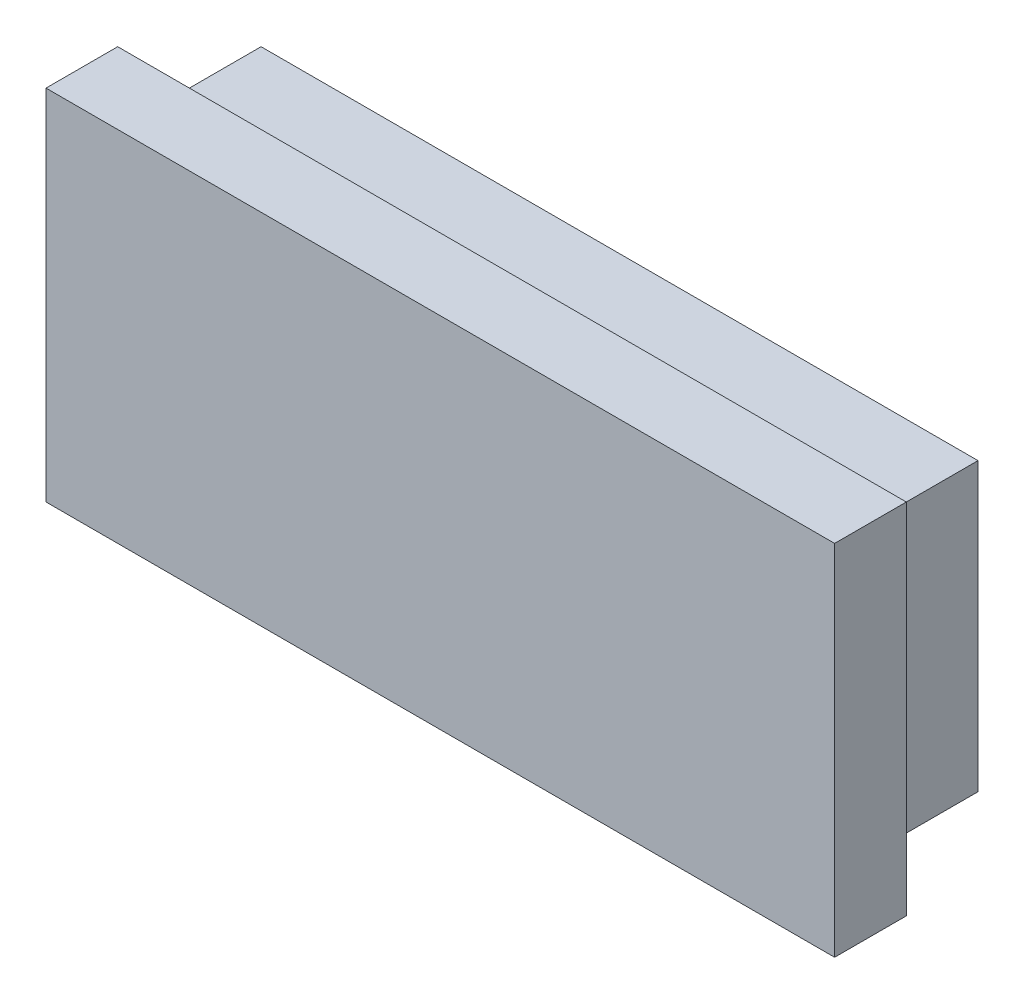
ISO-10303-21;
HEADER;
FILE_DESCRIPTION(('STEP AP214'),'2;1');
FILE_NAME('part.step','',(''),(''),'','','');
FILE_SCHEMA(('AUTOMOTIVE_DESIGN { 1 0 10303 214 1 1 1 1 }'));
ENDSEC;
DATA;
#1=APPLICATION_CONTEXT('core data for automotive mechanical design processes');
#2=APPLICATION_PROTOCOL_DEFINITION('international standard','automotive_design',2000,#1);
#3=PRODUCT_CONTEXT('',#1,'mechanical');
#4=PRODUCT('Part','Part','',(#3));
#5=PRODUCT_RELATED_PRODUCT_CATEGORY('part','',(#4));
#6=PRODUCT_DEFINITION_FORMATION('','',#4);
#7=PRODUCT_DEFINITION_CONTEXT('part definition',#1,'design');
#8=PRODUCT_DEFINITION('design','',#6,#7);
#9=PRODUCT_DEFINITION_SHAPE('','',#8);
#10=(LENGTH_UNIT() NAMED_UNIT(*) SI_UNIT(.MILLI.,.METRE.));
#11=(NAMED_UNIT(*) PLANE_ANGLE_UNIT() SI_UNIT($,.RADIAN.));
#12=(NAMED_UNIT(*) SI_UNIT($,.STERADIAN.) SOLID_ANGLE_UNIT());
#13=UNCERTAINTY_MEASURE_WITH_UNIT(LENGTH_MEASURE(1.E-05),#10,'distance_accuracy_value','');
#14=(GEOMETRIC_REPRESENTATION_CONTEXT(3) GLOBAL_UNCERTAINTY_ASSIGNED_CONTEXT((#13)) GLOBAL_UNIT_ASSIGNED_CONTEXT((#10,
#11,#12)) REPRESENTATION_CONTEXT('',''));
#15=CARTESIAN_POINT('',(0.,0.,0.));
#16=DIRECTION('',(0.,0.,1.));
#17=DIRECTION('',(1.,0.,0.));
#18=AXIS2_PLACEMENT_3D('',#15,#16,#17);
#19=CARTESIAN_POINT('',(0.,0.,0.635));
#20=DIRECTION('',(0.,0.,1.));
#21=DIRECTION('',(1.,0.,0.));
#22=AXIS2_PLACEMENT_3D('',#19,#20,#21);
#23=PLANE('',#22);
#24=DIRECTION('',(0.,1.,0.));
#25=VECTOR('',#24,1.);
#26=CARTESIAN_POINT('',(6.985,3.175,0.635));
#27=LINE('',#26,#25);
#28=CARTESIAN_POINT('',(6.985,-3.175,0.635));
#29=VERTEX_POINT('',#28);
#30=CARTESIAN_POINT('',(6.985,3.175,0.635));
#31=VERTEX_POINT('',#30);
#32=EDGE_CURVE('E132',#29,#31,#27,.T.);
#33=ORIENTED_EDGE('',*,*,#32,.F.);
#34=DIRECTION('',(1.,0.,0.));
#35=VECTOR('',#34,1.);
#36=CARTESIAN_POINT('',(-6.985,-3.175,0.635));
#37=LINE('',#36,#35);
#38=CARTESIAN_POINT('',(-6.985,-3.175,0.635));
#39=VERTEX_POINT('',#38);
#40=EDGE_CURVE('E128',#39,#29,#37,.T.);
#41=ORIENTED_EDGE('',*,*,#40,.F.);
#42=DIRECTION('',(0.,-1.,0.));
#43=VECTOR('',#42,1.);
#44=CARTESIAN_POINT('',(-6.985,3.175,0.635));
#45=LINE('',#44,#43);
#46=CARTESIAN_POINT('',(-6.985,3.175,0.635));
#47=VERTEX_POINT('',#46);
#48=EDGE_CURVE('E279',#47,#39,#45,.T.);
#49=ORIENTED_EDGE('',*,*,#48,.F.);
#50=DIRECTION('',(-1.,0.,0.));
#51=VECTOR('',#50,1.);
#52=CARTESIAN_POINT('',(-6.985,3.175,0.635));
#53=LINE('',#52,#51);
#54=EDGE_CURVE('E283',#31,#47,#53,.T.);
#55=ORIENTED_EDGE('',*,*,#54,.F.);
#56=EDGE_LOOP('',(#33,#41,#49,#55));
#57=FACE_BOUND('',#56,.T.);
#58=DIRECTION('',(1.,0.,0.));
#59=VECTOR('',#58,1.);
#60=CARTESIAN_POINT('',(-6.35,2.54,0.635));
#61=LINE('',#60,#59);
#62=CARTESIAN_POINT('',(-6.35,2.54,0.635));
#63=VERTEX_POINT('',#62);
#64=CARTESIAN_POINT('',(6.35,2.54,0.635));
#65=VERTEX_POINT('',#64);
#66=EDGE_CURVE('E11',#63,#65,#61,.T.);
#67=ORIENTED_EDGE('',*,*,#66,.F.);
#68=DIRECTION('',(0.,-1.,0.));
#69=VECTOR('',#68,1.);
#70=CARTESIAN_POINT('',(-6.35,2.54,0.635));
#71=LINE('',#70,#69);
#72=CARTESIAN_POINT('',(-6.35,-2.54,0.635));
#73=VERTEX_POINT('',#72);
#74=EDGE_CURVE('E145',#63,#73,#71,.T.);
#75=ORIENTED_EDGE('',*,*,#74,.T.);
#76=DIRECTION('',(1.,0.,0.));
#77=VECTOR('',#76,1.);
#78=CARTESIAN_POINT('',(-6.35,-2.54,0.635));
#79=LINE('',#78,#77);
#80=CARTESIAN_POINT('',(6.35,-2.54,0.635));
#81=VERTEX_POINT('',#80);
#82=EDGE_CURVE('E137',#73,#81,#79,.T.);
#83=ORIENTED_EDGE('',*,*,#82,.T.);
#84=DIRECTION('',(0.,-1.,0.));
#85=VECTOR('',#84,1.);
#86=CARTESIAN_POINT('',(6.35,2.54,0.635));
#87=LINE('',#86,#85);
#88=EDGE_CURVE('E55',#65,#81,#87,.T.);
#89=ORIENTED_EDGE('',*,*,#88,.F.);
#90=EDGE_LOOP('',(#67,#75,#83,#89));
#91=FACE_BOUND('',#90,.T.);
#92=ADVANCED_FACE('F39',(#57,#91),#23,.F.);
#93=CARTESIAN_POINT('',(6.985,3.175,1.905));
#94=DIRECTION('',(-1.,0.,0.));
#95=DIRECTION('',(0.,-1.,0.));
#96=AXIS2_PLACEMENT_3D('',#93,#94,#95);
#97=PLANE('',#96);
#98=ORIENTED_EDGE('',*,*,#32,.T.);
#99=DIRECTION('',(0.,0.,-1.));
#100=VECTOR('',#99,1.);
#101=CARTESIAN_POINT('',(6.985,3.175,1.905));
#102=LINE('',#101,#100);
#103=CARTESIAN_POINT('',(6.985,3.175,1.905));
#104=VERTEX_POINT('',#103);
#105=EDGE_CURVE('E110',#104,#31,#102,.T.);
#106=ORIENTED_EDGE('',*,*,#105,.F.);
#107=DIRECTION('',(0.,1.,0.));
#108=VECTOR('',#107,1.);
#109=CARTESIAN_POINT('',(6.985,3.175,1.905));
#110=LINE('',#109,#108);
#111=CARTESIAN_POINT('',(6.985,-3.175,1.905));
#112=VERTEX_POINT('',#111);
#113=EDGE_CURVE('E118',#112,#104,#110,.T.);
#114=ORIENTED_EDGE('',*,*,#113,.F.);
#115=DIRECTION('',(0.,0.,-1.));
#116=VECTOR('',#115,1.);
#117=CARTESIAN_POINT('',(6.985,-3.175,1.905));
#118=LINE('',#117,#116);
#119=EDGE_CURVE('E286',#112,#29,#118,.T.);
#120=ORIENTED_EDGE('',*,*,#119,.T.);
#121=EDGE_LOOP('',(#98,#106,#114,#120));
#122=FACE_BOUND('',#121,.T.);
#123=ADVANCED_FACE('F130',(#122),#97,.F.);
#124=CARTESIAN_POINT('',(-6.985,3.175,1.905));
#125=DIRECTION('',(0.,-1.,0.));
#126=DIRECTION('',(0.,0.,-1.));
#127=AXIS2_PLACEMENT_3D('',#124,#125,#126);
#128=PLANE('',#127);
#129=ORIENTED_EDGE('',*,*,#54,.T.);
#130=DIRECTION('',(0.,0.,-1.));
#131=VECTOR('',#130,1.);
#132=CARTESIAN_POINT('',(-6.985,3.175,1.905));
#133=LINE('',#132,#131);
#134=CARTESIAN_POINT('',(-6.985,3.175,1.905));
#135=VERTEX_POINT('',#134);
#136=EDGE_CURVE('E113',#135,#47,#133,.T.);
#137=ORIENTED_EDGE('',*,*,#136,.F.);
#138=DIRECTION('',(-1.,0.,0.));
#139=VECTOR('',#138,1.);
#140=CARTESIAN_POINT('',(-6.985,3.175,1.905));
#141=LINE('',#140,#139);
#142=EDGE_CURVE('E106',#104,#135,#141,.T.);
#143=ORIENTED_EDGE('',*,*,#142,.F.);
#144=ORIENTED_EDGE('',*,*,#105,.T.);
#145=EDGE_LOOP('',(#129,#137,#143,#144));
#146=FACE_BOUND('',#145,.T.);
#147=ADVANCED_FACE('F108',(#146),#128,.F.);
#148=CARTESIAN_POINT('',(-6.985,3.175,1.905));
#149=DIRECTION('',(1.,0.,0.));
#150=DIRECTION('',(0.,1.,0.));
#151=AXIS2_PLACEMENT_3D('',#148,#149,#150);
#152=PLANE('',#151);
#153=ORIENTED_EDGE('',*,*,#48,.T.);
#154=DIRECTION('',(0.,0.,-1.));
#155=VECTOR('',#154,1.);
#156=CARTESIAN_POINT('',(-6.985,-3.175,1.905));
#157=LINE('',#156,#155);
#158=CARTESIAN_POINT('',(-6.985,-3.175,1.905));
#159=VERTEX_POINT('',#158);
#160=EDGE_CURVE('E139',#159,#39,#157,.T.);
#161=ORIENTED_EDGE('',*,*,#160,.F.);
#162=DIRECTION('',(0.,-1.,0.));
#163=VECTOR('',#162,1.);
#164=CARTESIAN_POINT('',(-6.985,3.175,1.905));
#165=LINE('',#164,#163);
#166=EDGE_CURVE('E117',#135,#159,#165,.T.);
#167=ORIENTED_EDGE('',*,*,#166,.F.);
#168=ORIENTED_EDGE('',*,*,#136,.T.);
#169=EDGE_LOOP('',(#153,#161,#167,#168));
#170=FACE_BOUND('',#169,.T.);
#171=ADVANCED_FACE('F199',(#170),#152,.F.);
#172=CARTESIAN_POINT('',(-6.985,-3.175,1.905));
#173=DIRECTION('',(0.,1.,0.));
#174=DIRECTION('',(0.,0.,1.));
#175=AXIS2_PLACEMENT_3D('',#172,#173,#174);
#176=PLANE('',#175);
#177=ORIENTED_EDGE('',*,*,#40,.T.);
#178=ORIENTED_EDGE('',*,*,#119,.F.);
#179=DIRECTION('',(1.,0.,0.));
#180=VECTOR('',#179,1.);
#181=CARTESIAN_POINT('',(-6.985,-3.175,1.905));
#182=LINE('',#181,#180);
#183=EDGE_CURVE('E123',#159,#112,#182,.T.);
#184=ORIENTED_EDGE('',*,*,#183,.F.);
#185=ORIENTED_EDGE('',*,*,#160,.T.);
#186=EDGE_LOOP('',(#177,#178,#184,#185));
#187=FACE_BOUND('',#186,.T.);
#188=ADVANCED_FACE('F187',(#187),#176,.F.);
#189=CARTESIAN_POINT('',(0.,0.,1.905));
#190=DIRECTION('',(0.,0.,1.));
#191=DIRECTION('',(1.,0.,0.));
#192=AXIS2_PLACEMENT_3D('',#189,#190,#191);
#193=PLANE('',#192);
#194=ORIENTED_EDGE('',*,*,#113,.T.);
#195=ORIENTED_EDGE('',*,*,#142,.T.);
#196=ORIENTED_EDGE('',*,*,#166,.T.);
#197=ORIENTED_EDGE('',*,*,#183,.T.);
#198=EDGE_LOOP('',(#194,#195,#196,#197));
#199=FACE_BOUND('',#198,.T.);
#200=ADVANCED_FACE('F121',(#199),#193,.T.);
#201=CARTESIAN_POINT('',(-6.35,2.54,1.27));
#202=DIRECTION('',(1.,0.,0.));
#203=DIRECTION('',(0.,0.,-1.));
#204=AXIS2_PLACEMENT_3D('',#201,#202,#203);
#205=PLANE('',#204);
#206=ORIENTED_EDGE('',*,*,#74,.F.);
#207=DIRECTION('',(0.,0.,-1.));
#208=VECTOR('',#207,1.);
#209=CARTESIAN_POINT('',(-6.35,2.54,1.27));
#210=LINE('',#209,#208);
#211=CARTESIAN_POINT('',(-6.35,2.54,-1.27));
#212=VERTEX_POINT('',#211);
#213=EDGE_CURVE('E62',#63,#212,#210,.T.);
#214=ORIENTED_EDGE('',*,*,#213,.T.);
#215=DIRECTION('',(0.,-1.,0.));
#216=VECTOR('',#215,1.);
#217=CARTESIAN_POINT('',(-6.35,2.54,-1.27));
#218=LINE('',#217,#216);
#219=CARTESIAN_POINT('',(-6.35,-2.54,-1.27));
#220=VERTEX_POINT('',#219);
#221=EDGE_CURVE('E148',#212,#220,#218,.T.);
#222=ORIENTED_EDGE('',*,*,#221,.T.);
#223=DIRECTION('',(0.,0.,-1.));
#224=VECTOR('',#223,1.);
#225=CARTESIAN_POINT('',(-6.35,-2.54,1.27));
#226=LINE('',#225,#224);
#227=EDGE_CURVE('E48',#73,#220,#226,.T.);
#228=ORIENTED_EDGE('',*,*,#227,.F.);
#229=EDGE_LOOP('',(#206,#214,#222,#228));
#230=FACE_BOUND('',#229,.T.);
#231=ADVANCED_FACE('F41',(#230),#205,.F.);
#232=CARTESIAN_POINT('',(-6.35,-2.54,1.27));
#233=DIRECTION('',(0.,1.,0.));
#234=DIRECTION('',(0.,0.,1.));
#235=AXIS2_PLACEMENT_3D('',#232,#233,#234);
#236=PLANE('',#235);
#237=ORIENTED_EDGE('',*,*,#82,.F.);
#238=ORIENTED_EDGE('',*,*,#227,.T.);
#239=DIRECTION('',(1.,0.,0.));
#240=VECTOR('',#239,1.);
#241=CARTESIAN_POINT('',(-6.35,-2.54,-1.27));
#242=LINE('',#241,#240);
#243=CARTESIAN_POINT('',(6.35,-2.54,-1.27));
#244=VERTEX_POINT('',#243);
#245=EDGE_CURVE('E151',#220,#244,#242,.T.);
#246=ORIENTED_EDGE('',*,*,#245,.T.);
#247=DIRECTION('',(0.,0.,-1.));
#248=VECTOR('',#247,1.);
#249=CARTESIAN_POINT('',(6.35,-2.54,1.27));
#250=LINE('',#249,#248);
#251=EDGE_CURVE('E168',#81,#244,#250,.T.);
#252=ORIENTED_EDGE('',*,*,#251,.F.);
#253=EDGE_LOOP('',(#237,#238,#246,#252));
#254=FACE_BOUND('',#253,.T.);
#255=ADVANCED_FACE('F175',(#254),#236,.F.);
#256=CARTESIAN_POINT('',(6.35,2.54,1.27));
#257=DIRECTION('',(1.,0.,0.));
#258=DIRECTION('',(0.,0.,-1.));
#259=AXIS2_PLACEMENT_3D('',#256,#257,#258);
#260=PLANE('',#259);
#261=DIRECTION('',(0.,0.,-1.));
#262=VECTOR('',#261,1.);
#263=CARTESIAN_POINT('',(6.35,2.54,1.27));
#264=LINE('',#263,#262);
#265=CARTESIAN_POINT('',(6.35,2.54,-1.27));
#266=VERTEX_POINT('',#265);
#267=EDGE_CURVE('E165',#65,#266,#264,.T.);
#268=ORIENTED_EDGE('',*,*,#267,.F.);
#269=ORIENTED_EDGE('',*,*,#88,.T.);
#270=ORIENTED_EDGE('',*,*,#251,.T.);
#271=DIRECTION('',(0.,-1.,0.));
#272=VECTOR('',#271,1.);
#273=CARTESIAN_POINT('',(6.35,2.54,-1.27));
#274=LINE('',#273,#272);
#275=EDGE_CURVE('E155',#266,#244,#274,.T.);
#276=ORIENTED_EDGE('',*,*,#275,.F.);
#277=EDGE_LOOP('',(#268,#269,#270,#276));
#278=FACE_BOUND('',#277,.T.);
#279=ADVANCED_FACE('F186',(#278),#260,.T.);
#280=CARTESIAN_POINT('',(-6.35,2.54,1.27));
#281=DIRECTION('',(0.,1.,0.));
#282=DIRECTION('',(0.,0.,1.));
#283=AXIS2_PLACEMENT_3D('',#280,#281,#282);
#284=PLANE('',#283);
#285=ORIENTED_EDGE('',*,*,#213,.F.);
#286=ORIENTED_EDGE('',*,*,#66,.T.);
#287=ORIENTED_EDGE('',*,*,#267,.T.);
#288=DIRECTION('',(1.,0.,0.));
#289=VECTOR('',#288,1.);
#290=CARTESIAN_POINT('',(-6.35,2.54,-1.27));
#291=LINE('',#290,#289);
#292=EDGE_CURVE('E159',#212,#266,#291,.T.);
#293=ORIENTED_EDGE('',*,*,#292,.F.);
#294=EDGE_LOOP('',(#285,#286,#287,#293));
#295=FACE_BOUND('',#294,.T.);
#296=ADVANCED_FACE('F208',(#295),#284,.T.);
#297=CARTESIAN_POINT('',(0.,0.,-1.27));
#298=DIRECTION('',(0.,0.,1.));
#299=DIRECTION('',(1.,0.,0.));
#300=AXIS2_PLACEMENT_3D('',#297,#298,#299);
#301=PLANE('',#300);
#302=ORIENTED_EDGE('',*,*,#221,.F.);
#303=ORIENTED_EDGE('',*,*,#292,.T.);
#304=ORIENTED_EDGE('',*,*,#275,.T.);
#305=ORIENTED_EDGE('',*,*,#245,.F.);
#306=EDGE_LOOP('',(#302,#303,#304,#305));
#307=FACE_BOUND('',#306,.T.);
#308=ADVANCED_FACE('F178',(#307),#301,.F.);
#309=CLOSED_SHELL('',(#92,#123,#147,#171,#188,#200,#231,#255,#279,#296,#308));
#310=MANIFOLD_SOLID_BREP('B2',#309);
#311=ADVANCED_BREP_SHAPE_REPRESENTATION('',(#18,#310),#14);
#312=SHAPE_DEFINITION_REPRESENTATION(#9,#311);
ENDSEC;
END-ISO-10303-21;
